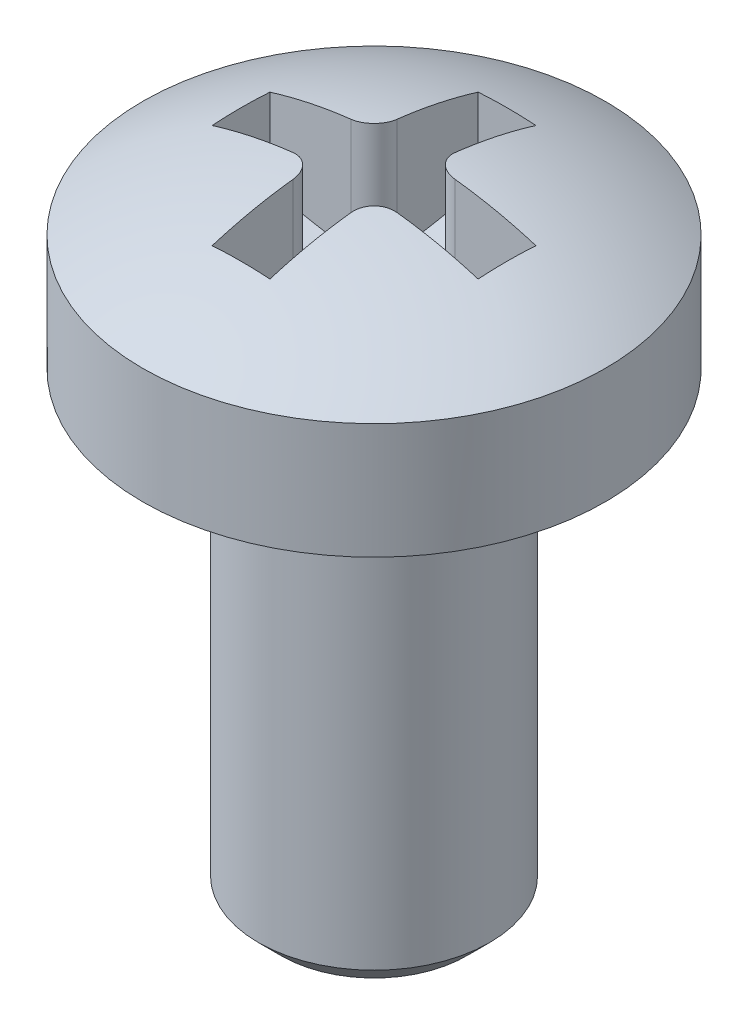
ISO-10303-21;
HEADER;
FILE_DESCRIPTION(('STEP AP214'),'2;1');
FILE_NAME('part.step','',(''),(''),'','','');
FILE_SCHEMA(('AUTOMOTIVE_DESIGN { 1 0 10303 214 1 1 1 1 }'));
ENDSEC;
DATA;
#1=APPLICATION_CONTEXT('core data for automotive mechanical design processes');
#2=APPLICATION_PROTOCOL_DEFINITION('international standard','automotive_design',2000,#1);
#3=PRODUCT_CONTEXT('',#1,'mechanical');
#4=PRODUCT('Part','Part','',(#3));
#5=PRODUCT_RELATED_PRODUCT_CATEGORY('part','',(#4));
#6=PRODUCT_DEFINITION_FORMATION('','',#4);
#7=PRODUCT_DEFINITION_CONTEXT('part definition',#1,'design');
#8=PRODUCT_DEFINITION('design','',#6,#7);
#9=PRODUCT_DEFINITION_SHAPE('','',#8);
#10=(LENGTH_UNIT() NAMED_UNIT(*) SI_UNIT(.MILLI.,.METRE.));
#11=(NAMED_UNIT(*) PLANE_ANGLE_UNIT() SI_UNIT($,.RADIAN.));
#12=(NAMED_UNIT(*) SI_UNIT($,.STERADIAN.) SOLID_ANGLE_UNIT());
#13=UNCERTAINTY_MEASURE_WITH_UNIT(LENGTH_MEASURE(1.E-05),#10,'distance_accuracy_value','');
#14=(GEOMETRIC_REPRESENTATION_CONTEXT(3) GLOBAL_UNCERTAINTY_ASSIGNED_CONTEXT((#13)) GLOBAL_UNIT_ASSIGNED_CONTEXT((#10,
#11,#12)) REPRESENTATION_CONTEXT('',''));
#15=CARTESIAN_POINT('',(0.,0.,0.));
#16=DIRECTION('',(0.,0.,1.));
#17=DIRECTION('',(1.,0.,0.));
#18=AXIS2_PLACEMENT_3D('',#15,#16,#17);
#19=CARTESIAN_POINT('',(2.,-8.,0.));
#20=DIRECTION('',(0.,1.,0.));
#21=DIRECTION('',(0.,0.,1.));
#22=AXIS2_PLACEMENT_3D('',#19,#20,#21);
#23=PLANE('',#22);
#24=CARTESIAN_POINT('',(0.,-8.,0.));
#25=DIRECTION('',(0.,1.,0.));
#26=DIRECTION('',(0.,0.,1.));
#27=AXIS2_PLACEMENT_3D('',#24,#25,#26);
#28=CIRCLE('',#27,1.6);
#29=CARTESIAN_POINT('',(0.,-8.,1.6));
#30=VERTEX_POINT('',#29);
#31=EDGE_CURVE('E11',#30,#30,#28,.F.);
#32=ORIENTED_EDGE('',*,*,#31,.T.);
#33=EDGE_LOOP('',(#32));
#34=FACE_BOUND('',#33,.T.);
#35=ADVANCED_FACE('F37',(#34),#23,.F.);
#36=CARTESIAN_POINT('',(0.,-4.72272727272728,0.));
#37=DIRECTION('',(0.,1.,0.));
#38=DIRECTION('',(1.,0.,0.));
#39=AXIS2_PLACEMENT_3D('',#36,#37,#38);
#40=SPHERICAL_SURFACE('',#39,7.82272727272728);
#41=CARTESIAN_POINT('',(0.5,-4.72272727272728,0.));
#42=DIRECTION('',(1.,0.,0.));
#43=DIRECTION('',(0.,0.,-1.));
#44=AXIS2_PLACEMENT_3D('',#41,#42,#43);
#45=CIRCLE('',#44,7.80673183755348);
#46=CARTESIAN_POINT('',(0.499999999999999,2.73750476008987,-2.3));
#47=VERTEX_POINT('',#46);
#48=CARTESIAN_POINT('',(0.5,3.03195273249996,-0.9));
#49=VERTEX_POINT('',#48);
#50=EDGE_CURVE('E195',#47,#49,#45,.T.);
#51=ORIENTED_EDGE('',*,*,#50,.T.);
#52=CARTESIAN_POINT('',(0.5,3.03195273249996,-0.9));
#53=CARTESIAN_POINT('',(0.499980445653111,3.03454133641409,-0.877715199489853));
#54=CARTESIAN_POINT('',(0.501861325410846,3.0369109081898,-0.855406290685576));
#55=CARTESIAN_POINT('',(0.509308944557218,3.04115309750786,-0.811373363194762));
#56=CARTESIAN_POINT('',(0.514874142284133,3.04302592244948,-0.789649103823202));
#57=CARTESIAN_POINT('',(0.529581237998282,3.04621922226135,-0.747382590966706));
#58=CARTESIAN_POINT('',(0.538725894104163,3.0475392695665,-0.726841263013532));
#59=CARTESIAN_POINT('',(0.560335395409864,3.04958563422558,-0.687561895208892));
#60=CARTESIAN_POINT('',(0.572799188800053,3.05031213937239,-0.668823286645484));
#61=CARTESIAN_POINT('',(0.600596407799792,3.05114682561896,-0.633816736919395));
#62=CARTESIAN_POINT('',(0.615908512897499,3.05125942358876,-0.617531968951503));
#63=CARTESIAN_POINT('',(0.649026593510928,3.0508747494218,-0.587736528915892));
#64=CARTESIAN_POINT('',(0.666832948845617,3.05037738431157,-0.57422628012003));
#65=CARTESIAN_POINT('',(0.704363578386314,3.04879030089852,-0.550401537052683));
#66=CARTESIAN_POINT('',(0.724081674108829,3.04770244181268,-0.540077170971166));
#67=CARTESIAN_POINT('',(0.764919862434989,3.04496752601447,-0.522847557382613));
#68=CARTESIAN_POINT('',(0.786039420133905,3.04332068167708,-0.515941013789887));
#69=CARTESIAN_POINT('',(0.822714805755103,3.04007942212771,-0.5072274099574));
#70=CARTESIAN_POINT('',(0.838074093965797,3.03861284502167,-0.504517057384848));
#71=CARTESIAN_POINT('',(0.868957976534767,3.0354499847468,-0.500903202638105));
#72=CARTESIAN_POINT('',(0.884482302646609,3.03375403356009,-0.499997118337815));
#73=CARTESIAN_POINT('',(0.9,3.03195273249996,-0.5));
#74=B_SPLINE_CURVE_WITH_KNOTS('',3,(#52,#53,#54,#55,#56,#57,#58,#59,#60,#61,#62,#63,#64,#65,#66,
#67,#68,#69,#70,#71,#72,#73),.UNSPECIFIED.,.F.,.F.,(4,2,2,2,2,2,2,2,2,2,4),(0.,
0.0672224170043276,0.134416723302517,0.201662907801201,0.268887807795911,0.335628401088124,
0.402379168562592,0.468920974876219,0.535437528240593,0.582332561709017,0.629160434341086),.UNSPECIFIED.);
#75=CARTESIAN_POINT('',(0.9,3.03195273249996,-0.5));
#76=VERTEX_POINT('',#75);
#77=EDGE_CURVE('E257',#49,#76,#74,.T.);
#78=ORIENTED_EDGE('',*,*,#77,.T.);
#79=CARTESIAN_POINT('',(0.,-4.72272727272728,-0.5));
#80=DIRECTION('',(0.,0.,-1.));
#81=DIRECTION('',(-1.,0.,0.));
#82=AXIS2_PLACEMENT_3D('',#79,#80,#81);
#83=CIRCLE('',#82,7.80673183755348);
#84=CARTESIAN_POINT('',(2.3,2.73750476008987,-0.5));
#85=VERTEX_POINT('',#84);
#86=EDGE_CURVE('E193',#76,#85,#83,.T.);
#87=ORIENTED_EDGE('',*,*,#86,.T.);
#88=CARTESIAN_POINT('',(2.3,-4.72272727272728,0.));
#89=DIRECTION('',(1.,0.,0.));
#90=DIRECTION('',(0.,0.,-1.));
#91=AXIS2_PLACEMENT_3D('',#88,#89,#90);
#92=CIRCLE('',#91,7.47696876972688);
#93=CARTESIAN_POINT('',(2.3,2.73750476008987,0.5));
#94=VERTEX_POINT('',#93);
#95=EDGE_CURVE('E170',#85,#94,#92,.T.);
#96=ORIENTED_EDGE('',*,*,#95,.T.);
#97=CARTESIAN_POINT('',(0.,-4.72272727272728,0.5));
#98=DIRECTION('',(0.,0.,1.));
#99=DIRECTION('',(1.,0.,0.));
#100=AXIS2_PLACEMENT_3D('',#97,#98,#99);
#101=CIRCLE('',#100,7.80673183755348);
#102=CARTESIAN_POINT('',(0.9,3.03195273249996,0.5));
#103=VERTEX_POINT('',#102);
#104=EDGE_CURVE('E219',#94,#103,#101,.T.);
#105=ORIENTED_EDGE('',*,*,#104,.T.);
#106=CARTESIAN_POINT('',(0.9,3.03195273249996,0.5));
#107=CARTESIAN_POINT('',(0.877715199489853,3.03454133641409,0.499980445653111));
#108=CARTESIAN_POINT('',(0.855406290685576,3.0369109081898,0.501861325410847));
#109=CARTESIAN_POINT('',(0.811373363194762,3.04115309750786,0.509308944557218));
#110=CARTESIAN_POINT('',(0.789649103823202,3.04302592244948,0.514874142284133));
#111=CARTESIAN_POINT('',(0.747382590966706,3.04621922226135,0.529581237998282));
#112=CARTESIAN_POINT('',(0.726841263013532,3.0475392695665,0.538725894104163));
#113=CARTESIAN_POINT('',(0.687561895208891,3.04958563422558,0.560335395409864));
#114=CARTESIAN_POINT('',(0.668823286645484,3.05031213937239,0.572799188800053));
#115=CARTESIAN_POINT('',(0.633816736919395,3.05114682561896,0.600596407799792));
#116=CARTESIAN_POINT('',(0.617531968951503,3.05125942358877,0.6159085128975));
#117=CARTESIAN_POINT('',(0.587736528915892,3.0508747494218,0.649026593510929));
#118=CARTESIAN_POINT('',(0.57422628012003,3.05037738431157,0.666832948845617));
#119=CARTESIAN_POINT('',(0.550401537052683,3.04879030089852,0.704363578386314));
#120=CARTESIAN_POINT('',(0.540077170971166,3.04770244181268,0.724081674108829));
#121=CARTESIAN_POINT('',(0.522847557382613,3.04496752601447,0.764919862434989));
#122=CARTESIAN_POINT('',(0.515941013789886,3.04332068167708,0.786039420133905));
#123=CARTESIAN_POINT('',(0.5072274099574,3.04007942212771,0.822714805755103));
#124=CARTESIAN_POINT('',(0.504517057384848,3.03861284502167,0.838074093965798));
#125=CARTESIAN_POINT('',(0.500903202638105,3.03544998474679,0.868957976534767));
#126=CARTESIAN_POINT('',(0.499997118337815,3.03375403356009,0.884482302646609));
#127=CARTESIAN_POINT('',(0.5,3.03195273249996,0.9));
#128=B_SPLINE_CURVE_WITH_KNOTS('',3,(#106,#107,#108,#109,#110,#111,#112,#113,#114,#115,#116,
#117,#118,#119,#120,#121,#122,#123,#124,#125,#126,#127),.UNSPECIFIED.,.F.,.F.,(4,2,2,2,2,2,2,2,
2,2,4),(0.,0.0672224170043276,0.134416723302517,0.201662907801201,0.268887807795911,
0.335628401088124,0.402379168562592,0.468920974876219,0.535437528240593,0.582332561709017,
0.629160434341086),.UNSPECIFIED.);
#129=CARTESIAN_POINT('',(0.5,3.03195273249996,0.9));
#130=VERTEX_POINT('',#129);
#131=EDGE_CURVE('E252',#103,#130,#128,.T.);
#132=ORIENTED_EDGE('',*,*,#131,.T.);
#133=CARTESIAN_POINT('',(0.5,-4.72272727272728,0.));
#134=DIRECTION('',(1.,0.,0.));
#135=DIRECTION('',(0.,0.,-1.));
#136=AXIS2_PLACEMENT_3D('',#133,#134,#135);
#137=CIRCLE('',#136,7.80673183755348);
#138=CARTESIAN_POINT('',(0.5,2.73750476008987,2.3));
#139=VERTEX_POINT('',#138);
#140=EDGE_CURVE('E217',#130,#139,#137,.T.);
#141=ORIENTED_EDGE('',*,*,#140,.T.);
#142=CARTESIAN_POINT('',(0.,-4.72272727272728,2.3));
#143=DIRECTION('',(0.,0.,1.));
#144=DIRECTION('',(1.,0.,0.));
#145=AXIS2_PLACEMENT_3D('',#142,#143,#144);
#146=CIRCLE('',#145,7.47696876972688);
#147=CARTESIAN_POINT('',(-0.5,2.73750476008987,2.3));
#148=VERTEX_POINT('',#147);
#149=EDGE_CURVE('E214',#139,#148,#146,.T.);
#150=ORIENTED_EDGE('',*,*,#149,.T.);
#151=CARTESIAN_POINT('',(-0.5,-4.72272727272728,0.));
#152=DIRECTION('',(-1.,0.,0.));
#153=DIRECTION('',(0.,0.,1.));
#154=AXIS2_PLACEMENT_3D('',#151,#152,#153);
#155=CIRCLE('',#154,7.80673183755348);
#156=CARTESIAN_POINT('',(-0.5,3.03195273249996,0.9));
#157=VERTEX_POINT('',#156);
#158=EDGE_CURVE('E211',#148,#157,#155,.T.);
#159=ORIENTED_EDGE('',*,*,#158,.T.);
#160=CARTESIAN_POINT('',(-0.5,3.03195273249996,0.9));
#161=CARTESIAN_POINT('',(-0.499980445653111,3.03454133641409,0.877715199489853));
#162=CARTESIAN_POINT('',(-0.501861325410847,3.0369109081898,0.855406290685576));
#163=CARTESIAN_POINT('',(-0.509308944557218,3.04115309750786,0.811373363194762));
#164=CARTESIAN_POINT('',(-0.514874142284133,3.04302592244948,0.789649103823202));
#165=CARTESIAN_POINT('',(-0.529581237998282,3.04621922226135,0.747382590966706));
#166=CARTESIAN_POINT('',(-0.538725894104163,3.0475392695665,0.726841263013532));
#167=CARTESIAN_POINT('',(-0.560335395409864,3.04958563422558,0.687561895208891));
#168=CARTESIAN_POINT('',(-0.572799188800053,3.05031213937239,0.668823286645484));
#169=CARTESIAN_POINT('',(-0.600596407799792,3.05114682561896,0.633816736919395));
#170=CARTESIAN_POINT('',(-0.6159085128975,3.05125942358876,0.617531968951503));
#171=CARTESIAN_POINT('',(-0.649026593510929,3.0508747494218,0.587736528915892));
#172=CARTESIAN_POINT('',(-0.666832948845617,3.05037738431157,0.57422628012003));
#173=CARTESIAN_POINT('',(-0.704363578386314,3.04879030089852,0.550401537052683));
#174=CARTESIAN_POINT('',(-0.724081674108829,3.04770244181268,0.540077170971166));
#175=CARTESIAN_POINT('',(-0.764919862434989,3.04496752601447,0.522847557382613));
#176=CARTESIAN_POINT('',(-0.786039420133905,3.04332068167708,0.515941013789886));
#177=CARTESIAN_POINT('',(-0.822714805755104,3.04007942212771,0.5072274099574));
#178=CARTESIAN_POINT('',(-0.838074093965798,3.03861284502167,0.504517057384848));
#179=CARTESIAN_POINT('',(-0.868957976534767,3.0354499847468,0.500903202638105));
#180=CARTESIAN_POINT('',(-0.88448230264661,3.03375403356009,0.499997118337815));
#181=CARTESIAN_POINT('',(-0.9,3.03195273249996,0.5));
#182=B_SPLINE_CURVE_WITH_KNOTS('',3,(#160,#161,#162,#163,#164,#165,#166,#167,#168,#169,#170,
#171,#172,#173,#174,#175,#176,#177,#178,#179,#180,#181),.UNSPECIFIED.,.F.,.F.,(4,2,2,2,2,2,2,2,
2,2,4),(0.,0.0672224170043276,0.134416723302517,0.201662907801201,0.268887807795911,
0.335628401088124,0.402379168562592,0.468920974876219,0.535437528240593,0.582332561709017,
0.629160434341086),.UNSPECIFIED.);
#183=CARTESIAN_POINT('',(-0.9,3.03195273249996,0.5));
#184=VERTEX_POINT('',#183);
#185=EDGE_CURVE('E231',#157,#184,#182,.T.);
#186=ORIENTED_EDGE('',*,*,#185,.T.);
#187=CARTESIAN_POINT('',(0.,-4.72272727272728,0.5));
#188=DIRECTION('',(0.,0.,1.));
#189=DIRECTION('',(1.,0.,0.));
#190=AXIS2_PLACEMENT_3D('',#187,#188,#189);
#191=CIRCLE('',#190,7.80673183755348);
#192=CARTESIAN_POINT('',(-2.3,2.73750476008987,0.5));
#193=VERTEX_POINT('',#192);
#194=EDGE_CURVE('E209',#184,#193,#191,.T.);
#195=ORIENTED_EDGE('',*,*,#194,.T.);
#196=CARTESIAN_POINT('',(-2.3,-4.72272727272728,0.));
#197=DIRECTION('',(-1.,0.,0.));
#198=DIRECTION('',(0.,0.,1.));
#199=AXIS2_PLACEMENT_3D('',#196,#197,#198);
#200=CIRCLE('',#199,7.47696876972688);
#201=CARTESIAN_POINT('',(-2.3,2.73750476008987,-0.5));
#202=VERTEX_POINT('',#201);
#203=EDGE_CURVE('E206',#193,#202,#200,.T.);
#204=ORIENTED_EDGE('',*,*,#203,.T.);
#205=CARTESIAN_POINT('',(0.,-4.72272727272728,-0.5));
#206=DIRECTION('',(0.,0.,-1.));
#207=DIRECTION('',(-1.,0.,0.));
#208=AXIS2_PLACEMENT_3D('',#205,#206,#207);
#209=CIRCLE('',#208,7.80673183755348);
#210=CARTESIAN_POINT('',(-0.9,3.03195273249996,-0.5));
#211=VERTEX_POINT('',#210);
#212=EDGE_CURVE('E203',#202,#211,#209,.T.);
#213=ORIENTED_EDGE('',*,*,#212,.T.);
#214=CARTESIAN_POINT('',(-0.9,3.03195273249996,-0.5));
#215=CARTESIAN_POINT('',(-0.877715199489853,3.03454133641409,-0.499980445653111));
#216=CARTESIAN_POINT('',(-0.855406290685576,3.0369109081898,-0.501861325410847));
#217=CARTESIAN_POINT('',(-0.811373363194762,3.04115309750786,-0.509308944557218));
#218=CARTESIAN_POINT('',(-0.789649103823202,3.04302592244948,-0.514874142284133));
#219=CARTESIAN_POINT('',(-0.747382590966706,3.04621922226135,-0.529581237998282));
#220=CARTESIAN_POINT('',(-0.726841263013532,3.0475392695665,-0.538725894104163));
#221=CARTESIAN_POINT('',(-0.687561895208891,3.04958563422558,-0.560335395409864));
#222=CARTESIAN_POINT('',(-0.668823286645484,3.05031213937239,-0.572799188800053));
#223=CARTESIAN_POINT('',(-0.633816736919395,3.05114682561896,-0.600596407799792));
#224=CARTESIAN_POINT('',(-0.617531968951503,3.05125942358877,-0.6159085128975));
#225=CARTESIAN_POINT('',(-0.587736528915892,3.0508747494218,-0.649026593510929));
#226=CARTESIAN_POINT('',(-0.57422628012003,3.05037738431157,-0.666832948845617));
#227=CARTESIAN_POINT('',(-0.550401537052683,3.04879030089852,-0.704363578386314));
#228=CARTESIAN_POINT('',(-0.540077170971166,3.04770244181268,-0.724081674108829));
#229=CARTESIAN_POINT('',(-0.522847557382613,3.04496752601447,-0.764919862434989));
#230=CARTESIAN_POINT('',(-0.515941013789886,3.04332068167708,-0.786039420133905));
#231=CARTESIAN_POINT('',(-0.5072274099574,3.04007942212771,-0.822714805755103));
#232=CARTESIAN_POINT('',(-0.504517057384848,3.03861284502167,-0.838074093965798));
#233=CARTESIAN_POINT('',(-0.500903202638105,3.03544998474679,-0.868957976534767));
#234=CARTESIAN_POINT('',(-0.499997118337815,3.03375403356009,-0.88448230264661));
#235=CARTESIAN_POINT('',(-0.5,3.03195273249996,-0.9));
#236=B_SPLINE_CURVE_WITH_KNOTS('',3,(#214,#215,#216,#217,#218,#219,#220,#221,#222,#223,#224,
#225,#226,#227,#228,#229,#230,#231,#232,#233,#234,#235),.UNSPECIFIED.,.F.,.F.,(4,2,2,2,2,2,2,2,
2,2,4),(0.,0.0672224170043276,0.134416723302517,0.201662907801201,0.268887807795911,
0.335628401088124,0.402379168562592,0.468920974876219,0.535437528240593,0.582332561709017,
0.629160434341086),.UNSPECIFIED.);
#237=CARTESIAN_POINT('',(-0.5,3.03195273249996,-0.9));
#238=VERTEX_POINT('',#237);
#239=EDGE_CURVE('E225',#211,#238,#236,.T.);
#240=ORIENTED_EDGE('',*,*,#239,.T.);
#241=CARTESIAN_POINT('',(-0.5,-4.72272727272728,0.));
#242=DIRECTION('',(-1.,0.,0.));
#243=DIRECTION('',(0.,0.,1.));
#244=AXIS2_PLACEMENT_3D('',#241,#242,#243);
#245=CIRCLE('',#244,7.80673183755348);
#246=CARTESIAN_POINT('',(-0.5,2.73750476008987,-2.3));
#247=VERTEX_POINT('',#246);
#248=EDGE_CURVE('E201',#238,#247,#245,.T.);
#249=ORIENTED_EDGE('',*,*,#248,.T.);
#250=CARTESIAN_POINT('',(0.,-4.72272727272728,-2.3));
#251=DIRECTION('',(0.,0.,-1.));
#252=DIRECTION('',(-1.,0.,0.));
#253=AXIS2_PLACEMENT_3D('',#250,#251,#252);
#254=CIRCLE('',#253,7.47696876972688);
#255=EDGE_CURVE('E198',#247,#47,#254,.T.);
#256=ORIENTED_EDGE('',*,*,#255,.T.);
#257=EDGE_LOOP('',(#51,#78,#87,#96,#105,#132,#141,#150,#159,#186,#195,#204,#213,#240,#249,#256));
#258=FACE_BOUND('',#257,.T.);
#259=CARTESIAN_POINT('',(0.,2.,0.));
#260=DIRECTION('',(0.,1.,0.));
#261=DIRECTION('',(0.,0.,1.));
#262=AXIS2_PLACEMENT_3D('',#259,#260,#261);
#263=CIRCLE('',#262,4.);
#264=CARTESIAN_POINT('',(0.,2.,4.));
#265=VERTEX_POINT('',#264);
#266=EDGE_CURVE('E189',#265,#265,#263,.T.);
#267=ORIENTED_EDGE('',*,*,#266,.T.);
#268=EDGE_LOOP('',(#267));
#269=FACE_BOUND('',#268,.T.);
#270=ADVANCED_FACE('F239',(#258,#269),#40,.T.);
#271=CARTESIAN_POINT('',(0.,3.1,0.));
#272=DIRECTION('',(0.,1.,0.));
#273=DIRECTION('',(0.,0.,1.));
#274=AXIS2_PLACEMENT_3D('',#271,#272,#273);
#275=CYLINDRICAL_SURFACE('',#274,4.);
#276=ORIENTED_EDGE('',*,*,#266,.F.);
#277=EDGE_LOOP('',(#276));
#278=FACE_BOUND('',#277,.T.);
#279=CARTESIAN_POINT('',(0.,0.,0.));
#280=DIRECTION('',(0.,1.,0.));
#281=DIRECTION('',(0.,0.,1.));
#282=AXIS2_PLACEMENT_3D('',#279,#280,#281);
#283=CIRCLE('',#282,4.);
#284=CARTESIAN_POINT('',(0.,0.,4.));
#285=VERTEX_POINT('',#284);
#286=EDGE_CURVE('E181',#285,#285,#283,.T.);
#287=ORIENTED_EDGE('',*,*,#286,.T.);
#288=EDGE_LOOP('',(#287));
#289=FACE_BOUND('',#288,.T.);
#290=ADVANCED_FACE('F244',(#278,#289),#275,.T.);
#291=CARTESIAN_POINT('',(4.,0.,0.));
#292=DIRECTION('',(0.,1.,0.));
#293=DIRECTION('',(0.,0.,1.));
#294=AXIS2_PLACEMENT_3D('',#291,#292,#293);
#295=PLANE('',#294);
#296=ORIENTED_EDGE('',*,*,#286,.F.);
#297=EDGE_LOOP('',(#296));
#298=FACE_BOUND('',#297,.T.);
#299=CARTESIAN_POINT('',(0.,0.,0.));
#300=DIRECTION('',(0.,1.,0.));
#301=DIRECTION('',(0.,0.,1.));
#302=AXIS2_PLACEMENT_3D('',#299,#300,#301);
#303=CIRCLE('',#302,2.);
#304=CARTESIAN_POINT('',(0.,0.,2.));
#305=VERTEX_POINT('',#304);
#306=EDGE_CURVE('E178',#305,#305,#303,.T.);
#307=ORIENTED_EDGE('',*,*,#306,.T.);
#308=EDGE_LOOP('',(#307));
#309=FACE_BOUND('',#308,.T.);
#310=ADVANCED_FACE('F331',(#298,#309),#295,.F.);
#311=CARTESIAN_POINT('',(0.,3.1,0.));
#312=DIRECTION('',(0.,1.,0.));
#313=DIRECTION('',(0.,0.,1.));
#314=AXIS2_PLACEMENT_3D('',#311,#312,#313);
#315=CYLINDRICAL_SURFACE('',#314,2.);
#316=CARTESIAN_POINT('',(0.,-7.6,0.));
#317=DIRECTION('',(0.,1.,0.));
#318=DIRECTION('',(0.,0.,1.));
#319=AXIS2_PLACEMENT_3D('',#316,#317,#318);
#320=CIRCLE('',#319,2.);
#321=CARTESIAN_POINT('',(0.,-7.6,2.));
#322=VERTEX_POINT('',#321);
#323=EDGE_CURVE('E45',#322,#322,#320,.T.);
#324=ORIENTED_EDGE('',*,*,#323,.T.);
#325=EDGE_LOOP('',(#324));
#326=FACE_BOUND('',#325,.T.);
#327=ORIENTED_EDGE('',*,*,#306,.F.);
#328=EDGE_LOOP('',(#327));
#329=FACE_BOUND('',#328,.T.);
#330=ADVANCED_FACE('F303',(#326,#329),#315,.T.);
#331=CARTESIAN_POINT('',(0.5,-8.001,0.5));
#332=DIRECTION('',(0.,0.,1.));
#333=DIRECTION('',(1.,0.,0.));
#334=AXIS2_PLACEMENT_3D('',#331,#332,#333);
#335=PLANE('',#334);
#336=CARTESIAN_POINT('',(0.,9.49999999999998,0.5));
#337=DIRECTION('',(0.,0.,1.));
#338=DIRECTION('',(1.,0.,0.));
#339=AXIS2_PLACEMENT_3D('',#336,#337,#338);
#340=CIRCLE('',#339,8.48528137423855);
#341=CARTESIAN_POINT('',(2.3,1.3323810079069,0.5));
#342=VERTEX_POINT('',#341);
#343=CARTESIAN_POINT('',(0.9,1.06258333374486,0.5));
#344=VERTEX_POINT('',#343);
#345=EDGE_CURVE('E176',#342,#344,#340,.F.);
#346=ORIENTED_EDGE('',*,*,#345,.T.);
#347=DIRECTION('',(0.,1.,0.));
#348=VECTOR('',#347,1.);
#349=CARTESIAN_POINT('',(0.9,-8.001,0.5));
#350=LINE('',#349,#348);
#351=EDGE_CURVE('E556',#344,#103,#350,.T.);
#352=ORIENTED_EDGE('',*,*,#351,.T.);
#353=ORIENTED_EDGE('',*,*,#104,.F.);
#354=DIRECTION('',(0.,1.,0.));
#355=VECTOR('',#354,1.);
#356=CARTESIAN_POINT('',(2.3,-8.001,0.5));
#357=LINE('',#356,#355);
#358=EDGE_CURVE('E172',#342,#94,#357,.T.);
#359=ORIENTED_EDGE('',*,*,#358,.F.);
#360=EDGE_LOOP('',(#346,#352,#353,#359));
#361=FACE_BOUND('',#360,.T.);
#362=ADVANCED_FACE('F344',(#361),#335,.F.);
#363=CARTESIAN_POINT('',(0.5,-8.001,0.5));
#364=DIRECTION('',(1.,0.,0.));
#365=DIRECTION('',(0.,0.,-1.));
#366=AXIS2_PLACEMENT_3D('',#363,#364,#365);
#367=PLANE('',#366);
#368=ORIENTED_EDGE('',*,*,#140,.F.);
#369=DIRECTION('',(0.,1.,0.));
#370=VECTOR('',#369,1.);
#371=CARTESIAN_POINT('',(0.5,-8.001,0.9));
#372=LINE('',#371,#370);
#373=CARTESIAN_POINT('',(0.5,1.06258333374486,0.9));
#374=VERTEX_POINT('',#373);
#375=EDGE_CURVE('E554',#130,#374,#372,.F.);
#376=ORIENTED_EDGE('',*,*,#375,.T.);
#377=CARTESIAN_POINT('',(0.5,9.49999999999998,0.));
#378=DIRECTION('',(1.,0.,0.));
#379=DIRECTION('',(0.,0.,-1.));
#380=AXIS2_PLACEMENT_3D('',#377,#378,#379);
#381=CIRCLE('',#380,8.48528137423855);
#382=CARTESIAN_POINT('',(0.5,1.3323810079069,2.3));
#383=VERTEX_POINT('',#382);
#384=EDGE_CURVE('E183',#374,#383,#381,.F.);
#385=ORIENTED_EDGE('',*,*,#384,.T.);
#386=DIRECTION('',(0.,1.,0.));
#387=VECTOR('',#386,1.);
#388=CARTESIAN_POINT('',(0.5,-8.001,2.3));
#389=LINE('',#388,#387);
#390=EDGE_CURVE('E162',#383,#139,#389,.T.);
#391=ORIENTED_EDGE('',*,*,#390,.T.);
#392=EDGE_LOOP('',(#368,#376,#385,#391));
#393=FACE_BOUND('',#392,.T.);
#394=ADVANCED_FACE('F292',(#393),#367,.F.);
#395=CARTESIAN_POINT('',(-0.5,-8.001,2.3));
#396=DIRECTION('',(0.,0.,1.));
#397=DIRECTION('',(1.,0.,0.));
#398=AXIS2_PLACEMENT_3D('',#395,#396,#397);
#399=PLANE('',#398);
#400=ORIENTED_EDGE('',*,*,#390,.F.);
#401=CARTESIAN_POINT('',(0.,9.49999999999998,2.3));
#402=DIRECTION('',(0.,0.,1.));
#403=DIRECTION('',(1.,0.,0.));
#404=AXIS2_PLACEMENT_3D('',#401,#402,#403);
#405=CIRCLE('',#404,8.18290901819149);
#406=CARTESIAN_POINT('',(-0.5,1.3323810079069,2.3));
#407=VERTEX_POINT('',#406);
#408=EDGE_CURVE('E518',#383,#407,#405,.F.);
#409=ORIENTED_EDGE('',*,*,#408,.T.);
#410=DIRECTION('',(0.,1.,0.));
#411=VECTOR('',#410,1.);
#412=CARTESIAN_POINT('',(-0.5,-8.001,2.3));
#413=LINE('',#412,#411);
#414=EDGE_CURVE('E517',#407,#148,#413,.T.);
#415=ORIENTED_EDGE('',*,*,#414,.T.);
#416=ORIENTED_EDGE('',*,*,#149,.F.);
#417=EDGE_LOOP('',(#400,#409,#415,#416));
#418=FACE_BOUND('',#417,.T.);
#419=ADVANCED_FACE('F357',(#418),#399,.F.);
#420=CARTESIAN_POINT('',(-0.5,-8.001,0.5));
#421=DIRECTION('',(-1.,0.,0.));
#422=DIRECTION('',(0.,0.,1.));
#423=AXIS2_PLACEMENT_3D('',#420,#421,#422);
#424=PLANE('',#423);
#425=CARTESIAN_POINT('',(-0.5,9.49999999999998,0.));
#426=DIRECTION('',(-1.,0.,0.));
#427=DIRECTION('',(0.,0.,1.));
#428=AXIS2_PLACEMENT_3D('',#425,#426,#427);
#429=CIRCLE('',#428,8.48528137423855);
#430=CARTESIAN_POINT('',(-0.5,1.06258333374486,0.9));
#431=VERTEX_POINT('',#430);
#432=EDGE_CURVE('E512',#407,#431,#429,.F.);
#433=ORIENTED_EDGE('',*,*,#432,.T.);
#434=DIRECTION('',(0.,1.,0.));
#435=VECTOR('',#434,1.);
#436=CARTESIAN_POINT('',(-0.5,-8.001,0.9));
#437=LINE('',#436,#435);
#438=EDGE_CURVE('E507',#431,#157,#437,.T.);
#439=ORIENTED_EDGE('',*,*,#438,.T.);
#440=ORIENTED_EDGE('',*,*,#158,.F.);
#441=ORIENTED_EDGE('',*,*,#414,.F.);
#442=EDGE_LOOP('',(#433,#439,#440,#441));
#443=FACE_BOUND('',#442,.T.);
#444=ADVANCED_FACE('F364',(#443),#424,.F.);
#445=CARTESIAN_POINT('',(-2.3,-8.001,0.5));
#446=DIRECTION('',(0.,0.,1.));
#447=DIRECTION('',(1.,0.,0.));
#448=AXIS2_PLACEMENT_3D('',#445,#446,#447);
#449=PLANE('',#448);
#450=ORIENTED_EDGE('',*,*,#194,.F.);
#451=DIRECTION('',(0.,1.,0.));
#452=VECTOR('',#451,1.);
#453=CARTESIAN_POINT('',(-0.9,-8.001,0.5));
#454=LINE('',#453,#452);
#455=CARTESIAN_POINT('',(-0.9,1.06258333374486,0.5));
#456=VERTEX_POINT('',#455);
#457=EDGE_CURVE('E505',#184,#456,#454,.F.);
#458=ORIENTED_EDGE('',*,*,#457,.T.);
#459=CARTESIAN_POINT('',(0.,9.49999999999998,0.5));
#460=DIRECTION('',(0.,0.,1.));
#461=DIRECTION('',(1.,0.,0.));
#462=AXIS2_PLACEMENT_3D('',#459,#460,#461);
#463=CIRCLE('',#462,8.48528137423855);
#464=CARTESIAN_POINT('',(-2.3,1.3323810079069,0.5));
#465=VERTEX_POINT('',#464);
#466=EDGE_CURVE('E515',#456,#465,#463,.F.);
#467=ORIENTED_EDGE('',*,*,#466,.T.);
#468=DIRECTION('',(0.,1.,0.));
#469=VECTOR('',#468,1.);
#470=CARTESIAN_POINT('',(-2.3,-8.001,0.5));
#471=LINE('',#470,#469);
#472=EDGE_CURVE('E529',#465,#193,#471,.T.);
#473=ORIENTED_EDGE('',*,*,#472,.T.);
#474=EDGE_LOOP('',(#450,#458,#467,#473));
#475=FACE_BOUND('',#474,.T.);
#476=ADVANCED_FACE('F371',(#475),#449,.F.);
#477=CARTESIAN_POINT('',(-2.3,-8.001,-0.5));
#478=DIRECTION('',(-1.,0.,0.));
#479=DIRECTION('',(0.,0.,1.));
#480=AXIS2_PLACEMENT_3D('',#477,#478,#479);
#481=PLANE('',#480);
#482=ORIENTED_EDGE('',*,*,#472,.F.);
#483=CARTESIAN_POINT('',(-2.3,9.49999999999998,0.));
#484=DIRECTION('',(-1.,0.,0.));
#485=DIRECTION('',(0.,0.,1.));
#486=AXIS2_PLACEMENT_3D('',#483,#484,#485);
#487=CIRCLE('',#486,8.18290901819149);
#488=CARTESIAN_POINT('',(-2.3,1.3323810079069,-0.5));
#489=VERTEX_POINT('',#488);
#490=EDGE_CURVE('E521',#465,#489,#487,.F.);
#491=ORIENTED_EDGE('',*,*,#490,.T.);
#492=DIRECTION('',(0.,1.,0.));
#493=VECTOR('',#492,1.);
#494=CARTESIAN_POINT('',(-2.3,-8.001,-0.5));
#495=LINE('',#494,#493);
#496=EDGE_CURVE('E532',#489,#202,#495,.T.);
#497=ORIENTED_EDGE('',*,*,#496,.T.);
#498=ORIENTED_EDGE('',*,*,#203,.F.);
#499=EDGE_LOOP('',(#482,#491,#497,#498));
#500=FACE_BOUND('',#499,.T.);
#501=ADVANCED_FACE('F379',(#500),#481,.F.);
#502=CARTESIAN_POINT('',(-2.3,-8.001,-0.5));
#503=DIRECTION('',(0.,0.,-1.));
#504=DIRECTION('',(-1.,0.,0.));
#505=AXIS2_PLACEMENT_3D('',#502,#503,#504);
#506=PLANE('',#505);
#507=CARTESIAN_POINT('',(0.,9.49999999999998,-0.5));
#508=DIRECTION('',(0.,0.,-1.));
#509=DIRECTION('',(-1.,0.,0.));
#510=AXIS2_PLACEMENT_3D('',#507,#508,#509);
#511=CIRCLE('',#510,8.48528137423855);
#512=CARTESIAN_POINT('',(-0.9,1.06258333374486,-0.5));
#513=VERTEX_POINT('',#512);
#514=EDGE_CURVE('E564',#489,#513,#511,.F.);
#515=ORIENTED_EDGE('',*,*,#514,.T.);
#516=DIRECTION('',(0.,1.,0.));
#517=VECTOR('',#516,1.);
#518=CARTESIAN_POINT('',(-0.9,-8.001,-0.5));
#519=LINE('',#518,#517);
#520=EDGE_CURVE('E549',#513,#211,#519,.T.);
#521=ORIENTED_EDGE('',*,*,#520,.T.);
#522=ORIENTED_EDGE('',*,*,#212,.F.);
#523=ORIENTED_EDGE('',*,*,#496,.F.);
#524=EDGE_LOOP('',(#515,#521,#522,#523));
#525=FACE_BOUND('',#524,.T.);
#526=ADVANCED_FACE('F387',(#525),#506,.F.);
#527=CARTESIAN_POINT('',(-0.5,-8.001,-2.3));
#528=DIRECTION('',(-1.,0.,0.));
#529=DIRECTION('',(0.,0.,1.));
#530=AXIS2_PLACEMENT_3D('',#527,#528,#529);
#531=PLANE('',#530);
#532=ORIENTED_EDGE('',*,*,#248,.F.);
#533=DIRECTION('',(0.,1.,0.));
#534=VECTOR('',#533,1.);
#535=CARTESIAN_POINT('',(-0.5,-8.001,-0.9));
#536=LINE('',#535,#534);
#537=CARTESIAN_POINT('',(-0.5,1.06258333374486,-0.9));
#538=VERTEX_POINT('',#537);
#539=EDGE_CURVE('E52',#238,#538,#536,.F.);
#540=ORIENTED_EDGE('',*,*,#539,.T.);
#541=CARTESIAN_POINT('',(-0.5,9.49999999999998,0.));
#542=DIRECTION('',(-1.,0.,0.));
#543=DIRECTION('',(0.,0.,1.));
#544=AXIS2_PLACEMENT_3D('',#541,#542,#543);
#545=CIRCLE('',#544,8.48528137423855);
#546=CARTESIAN_POINT('',(-0.5,1.3323810079069,-2.3));
#547=VERTEX_POINT('',#546);
#548=EDGE_CURVE('E560',#538,#547,#545,.F.);
#549=ORIENTED_EDGE('',*,*,#548,.T.);
#550=DIRECTION('',(0.,1.,0.));
#551=VECTOR('',#550,1.);
#552=CARTESIAN_POINT('',(-0.5,-8.001,-2.3));
#553=LINE('',#552,#551);
#554=EDGE_CURVE('E535',#547,#247,#553,.T.);
#555=ORIENTED_EDGE('',*,*,#554,.T.);
#556=EDGE_LOOP('',(#532,#540,#549,#555));
#557=FACE_BOUND('',#556,.T.);
#558=ADVANCED_FACE('F395',(#557),#531,.F.);
#559=CARTESIAN_POINT('',(-0.5,-8.001,-2.3));
#560=DIRECTION('',(0.,0.,-1.));
#561=DIRECTION('',(-1.,0.,0.));
#562=AXIS2_PLACEMENT_3D('',#559,#560,#561);
#563=PLANE('',#562);
#564=ORIENTED_EDGE('',*,*,#554,.F.);
#565=CARTESIAN_POINT('',(0.,9.49999999999998,-2.3));
#566=DIRECTION('',(0.,0.,-1.));
#567=DIRECTION('',(-1.,0.,0.));
#568=AXIS2_PLACEMENT_3D('',#565,#566,#567);
#569=CIRCLE('',#568,8.18290901819149);
#570=CARTESIAN_POINT('',(0.499999999999999,1.3323810079069,-2.3));
#571=VERTEX_POINT('',#570);
#572=EDGE_CURVE('E543',#547,#571,#569,.F.);
#573=ORIENTED_EDGE('',*,*,#572,.T.);
#574=DIRECTION('',(0.,1.,0.));
#575=VECTOR('',#574,1.);
#576=CARTESIAN_POINT('',(0.5,-8.001,-2.3));
#577=LINE('',#576,#575);
#578=EDGE_CURVE('E171',#571,#47,#577,.T.);
#579=ORIENTED_EDGE('',*,*,#578,.T.);
#580=ORIENTED_EDGE('',*,*,#255,.F.);
#581=EDGE_LOOP('',(#564,#573,#579,#580));
#582=FACE_BOUND('',#581,.T.);
#583=ADVANCED_FACE('F403',(#582),#563,.F.);
#584=CARTESIAN_POINT('',(0.5,-8.001,-2.3));
#585=DIRECTION('',(1.,0.,0.));
#586=DIRECTION('',(0.,0.,-1.));
#587=AXIS2_PLACEMENT_3D('',#584,#585,#586);
#588=PLANE('',#587);
#589=CARTESIAN_POINT('',(0.5,9.49999999999998,0.));
#590=DIRECTION('',(1.,0.,0.));
#591=DIRECTION('',(0.,0.,-1.));
#592=AXIS2_PLACEMENT_3D('',#589,#590,#591);
#593=CIRCLE('',#592,8.48528137423855);
#594=CARTESIAN_POINT('',(0.5,1.06258333374486,-0.9));
#595=VERTEX_POINT('',#594);
#596=EDGE_CURVE('E161',#571,#595,#593,.F.);
#597=ORIENTED_EDGE('',*,*,#596,.T.);
#598=DIRECTION('',(0.,1.,0.));
#599=VECTOR('',#598,1.);
#600=CARTESIAN_POINT('',(0.5,-8.001,-0.9));
#601=LINE('',#600,#599);
#602=EDGE_CURVE('E222',#595,#49,#601,.T.);
#603=ORIENTED_EDGE('',*,*,#602,.T.);
#604=ORIENTED_EDGE('',*,*,#50,.F.);
#605=ORIENTED_EDGE('',*,*,#578,.F.);
#606=EDGE_LOOP('',(#597,#603,#604,#605));
#607=FACE_BOUND('',#606,.T.);
#608=ADVANCED_FACE('F410',(#607),#588,.F.);
#609=CARTESIAN_POINT('',(0.5,-8.001,-0.5));
#610=DIRECTION('',(0.,0.,-1.));
#611=DIRECTION('',(-1.,0.,0.));
#612=AXIS2_PLACEMENT_3D('',#609,#610,#611);
#613=PLANE('',#612);
#614=ORIENTED_EDGE('',*,*,#86,.F.);
#615=DIRECTION('',(0.,1.,0.));
#616=VECTOR('',#615,1.);
#617=CARTESIAN_POINT('',(0.9,-8.001,-0.5));
#618=LINE('',#617,#616);
#619=CARTESIAN_POINT('',(0.9,1.06258333374486,-0.5));
#620=VERTEX_POINT('',#619);
#621=EDGE_CURVE('E158',#76,#620,#618,.F.);
#622=ORIENTED_EDGE('',*,*,#621,.T.);
#623=CARTESIAN_POINT('',(0.,9.49999999999998,-0.5));
#624=DIRECTION('',(0.,0.,-1.));
#625=DIRECTION('',(-1.,0.,0.));
#626=AXIS2_PLACEMENT_3D('',#623,#624,#625);
#627=CIRCLE('',#626,8.48528137423855);
#628=CARTESIAN_POINT('',(2.3,1.3323810079069,-0.5));
#629=VERTEX_POINT('',#628);
#630=EDGE_CURVE('E152',#620,#629,#627,.F.);
#631=ORIENTED_EDGE('',*,*,#630,.T.);
#632=DIRECTION('',(0.,1.,0.));
#633=VECTOR('',#632,1.);
#634=CARTESIAN_POINT('',(2.3,-8.001,-0.5));
#635=LINE('',#634,#633);
#636=EDGE_CURVE('E156',#629,#85,#635,.T.);
#637=ORIENTED_EDGE('',*,*,#636,.T.);
#638=EDGE_LOOP('',(#614,#622,#631,#637));
#639=FACE_BOUND('',#638,.T.);
#640=ADVANCED_FACE('F155',(#639),#613,.F.);
#641=CARTESIAN_POINT('',(2.3,-8.001,-0.5));
#642=DIRECTION('',(1.,0.,0.));
#643=DIRECTION('',(0.,0.,-1.));
#644=AXIS2_PLACEMENT_3D('',#641,#642,#643);
#645=PLANE('',#644);
#646=ORIENTED_EDGE('',*,*,#636,.F.);
#647=CARTESIAN_POINT('',(2.3,9.49999999999998,0.));
#648=DIRECTION('',(1.,0.,0.));
#649=DIRECTION('',(0.,0.,-1.));
#650=AXIS2_PLACEMENT_3D('',#647,#648,#649);
#651=CIRCLE('',#650,8.18290901819149);
#652=EDGE_CURVE('E167',#629,#342,#651,.F.);
#653=ORIENTED_EDGE('',*,*,#652,.T.);
#654=ORIENTED_EDGE('',*,*,#358,.T.);
#655=ORIENTED_EDGE('',*,*,#95,.F.);
#656=EDGE_LOOP('',(#646,#653,#654,#655));
#657=FACE_BOUND('',#656,.T.);
#658=ADVANCED_FACE('F166',(#657),#645,.F.);
#659=CARTESIAN_POINT('',(0.,9.49999999999998,0.));
#660=DIRECTION('',(0.,1.,0.));
#661=DIRECTION('',(1.,0.,0.));
#662=AXIS2_PLACEMENT_3D('',#659,#660,#661);
#663=SPHERICAL_SURFACE('',#662,8.49999999999998);
#664=ORIENTED_EDGE('',*,*,#345,.F.);
#665=ORIENTED_EDGE('',*,*,#652,.F.);
#666=ORIENTED_EDGE('',*,*,#630,.F.);
#667=CARTESIAN_POINT('',(0.9,1.06258333374486,-0.5));
#668=CARTESIAN_POINT('',(0.877681895176581,1.06020064583187,-0.499980506377996));
#669=CARTESIAN_POINT('',(0.855344205727362,1.0580201488652,-0.501866869905914));
#670=CARTESIAN_POINT('',(0.811264196369215,1.05411756501269,-0.509332340473144));
#671=CARTESIAN_POINT('',(0.78952159882242,1.05239526097159,-0.514909693823375));
#672=CARTESIAN_POINT('',(0.747228556255667,1.04945966047884,-0.529643735623788));
#673=CARTESIAN_POINT('',(0.726678990033897,1.04824673524169,-0.538803025087882));
#674=CARTESIAN_POINT('',(0.687389852539137,1.04636746374655,-0.56044228034962));
#675=CARTESIAN_POINT('',(0.668649749482246,1.04570095646757,-0.572921266446781));
#676=CARTESIAN_POINT('',(0.633625729643449,1.04493649451643,-0.600763861630354));
#677=CARTESIAN_POINT('',(0.617327507926939,1.04483509156346,-0.616109383561911));
#678=CARTESIAN_POINT('',(0.587514637710959,1.04519463942213,-0.649299998886556));
#679=CARTESIAN_POINT('',(0.574000432084661,1.04565567962496,-0.667145489209941));
#680=CARTESIAN_POINT('',(0.55017165377276,1.04712438551599,-0.704769667803527));
#681=CARTESIAN_POINT('',(0.539848822620757,1.04813062146146,-0.724543189195622));
#682=CARTESIAN_POINT('',(0.522637980126425,1.05065941614313,-0.765498290560969));
#683=CARTESIAN_POINT('',(0.515748559609182,1.05218176262027,-0.78667928881133));
#684=CARTESIAN_POINT('',(0.507116958212197,1.05516459963325,-0.823303350164225));
#685=CARTESIAN_POINT('',(0.504448298653858,1.05650461680506,-0.838544928463922));
#686=CARTESIAN_POINT('',(0.500889732891837,1.05939256924764,-0.869192646434852));
#687=CARTESIAN_POINT('',(0.499997287547255,1.06094020433808,-0.884598519500552));
#688=CARTESIAN_POINT('',(0.5,1.06258333374486,-0.9));
#689=B_SPLINE_CURVE_WITH_KNOTS('',3,(#667,#668,#669,#670,#671,#672,#673,#674,#675,#676,#677,
#678,#679,#680,#681,#682,#683,#684,#685,#686,#687,#688),.UNSPECIFIED.,.F.,.F.,(4,2,2,2,2,2,2,2,
2,2,4),(0.,0.0672520458092346,0.134472161271656,0.201741179358209,0.268990367163335,
0.33582874565086,0.402677748396607,0.469352286257207,0.535999436300152,0.582495090258099,
0.628924229684279),.UNSPECIFIED.);
#690=EDGE_CURVE('E280',#620,#595,#689,.T.);
#691=ORIENTED_EDGE('',*,*,#690,.T.);
#692=ORIENTED_EDGE('',*,*,#596,.F.);
#693=ORIENTED_EDGE('',*,*,#572,.F.);
#694=ORIENTED_EDGE('',*,*,#548,.F.);
#695=CARTESIAN_POINT('',(-0.5,1.06258333374486,-0.9));
#696=CARTESIAN_POINT('',(-0.499980506377996,1.06020064583187,-0.877681895176581));
#697=CARTESIAN_POINT('',(-0.501866869905914,1.0580201488652,-0.855344205727362));
#698=CARTESIAN_POINT('',(-0.509332340473144,1.05411756501269,-0.811264196369215));
#699=CARTESIAN_POINT('',(-0.514909693823375,1.05239526097159,-0.789521598822421));
#700=CARTESIAN_POINT('',(-0.529643735623788,1.04945966047884,-0.747228556255667));
#701=CARTESIAN_POINT('',(-0.538803025087882,1.04824673524169,-0.726678990033897));
#702=CARTESIAN_POINT('',(-0.560442280349619,1.04636746374655,-0.687389852539137));
#703=CARTESIAN_POINT('',(-0.572921266446781,1.04570095646757,-0.668649749482246));
#704=CARTESIAN_POINT('',(-0.600763861630353,1.04493649451643,-0.633625729643449));
#705=CARTESIAN_POINT('',(-0.616109383561911,1.04483509156346,-0.617327507926939));
#706=CARTESIAN_POINT('',(-0.649299998886555,1.04519463942213,-0.58751463771096));
#707=CARTESIAN_POINT('',(-0.667145489209941,1.04565567962496,-0.574000432084661));
#708=CARTESIAN_POINT('',(-0.704769667803527,1.04712438551599,-0.550171653772761));
#709=CARTESIAN_POINT('',(-0.724543189195622,1.04813062146146,-0.539848822620758));
#710=CARTESIAN_POINT('',(-0.765498290560969,1.05065941614313,-0.522637980126425));
#711=CARTESIAN_POINT('',(-0.78667928881133,1.05218176262027,-0.515748559609182));
#712=CARTESIAN_POINT('',(-0.823303350164224,1.05516459963325,-0.507116958212197));
#713=CARTESIAN_POINT('',(-0.838544928463921,1.05650461680506,-0.504448298653858));
#714=CARTESIAN_POINT('',(-0.869192646434852,1.05939256924764,-0.500889732891837));
#715=CARTESIAN_POINT('',(-0.884598519500552,1.06094020433808,-0.499997287547255));
#716=CARTESIAN_POINT('',(-0.9,1.06258333374486,-0.5));
#717=B_SPLINE_CURVE_WITH_KNOTS('',3,(#695,#696,#697,#698,#699,#700,#701,#702,#703,#704,#705,
#706,#707,#708,#709,#710,#711,#712,#713,#714,#715,#716),.UNSPECIFIED.,.F.,.F.,(4,2,2,2,2,2,2,2,
2,2,4),(0.,0.0672520458092345,0.134472161271656,0.201741179358209,0.268990367163335,
0.33582874565086,0.402677748396607,0.469352286257207,0.535999436300152,0.582495090258099,
0.628924229684279),.UNSPECIFIED.);
#718=EDGE_CURVE('E59',#538,#513,#717,.T.);
#719=ORIENTED_EDGE('',*,*,#718,.T.);
#720=ORIENTED_EDGE('',*,*,#514,.F.);
#721=ORIENTED_EDGE('',*,*,#490,.F.);
#722=ORIENTED_EDGE('',*,*,#466,.F.);
#723=CARTESIAN_POINT('',(-0.9,1.06258333374486,0.5));
#724=CARTESIAN_POINT('',(-0.877681895176581,1.06020064583187,0.499980506377996));
#725=CARTESIAN_POINT('',(-0.855344205727362,1.0580201488652,0.501866869905914));
#726=CARTESIAN_POINT('',(-0.811264196369215,1.05411756501269,0.509332340473144));
#727=CARTESIAN_POINT('',(-0.789521598822421,1.05239526097159,0.514909693823375));
#728=CARTESIAN_POINT('',(-0.747228556255667,1.04945966047884,0.529643735623788));
#729=CARTESIAN_POINT('',(-0.726678990033897,1.04824673524169,0.538803025087882));
#730=CARTESIAN_POINT('',(-0.687389852539137,1.04636746374655,0.560442280349619));
#731=CARTESIAN_POINT('',(-0.668649749482246,1.04570095646757,0.572921266446781));
#732=CARTESIAN_POINT('',(-0.633625729643449,1.04493649451643,0.600763861630353));
#733=CARTESIAN_POINT('',(-0.617327507926939,1.04483509156346,0.616109383561911));
#734=CARTESIAN_POINT('',(-0.587514637710959,1.04519463942213,0.649299998886555));
#735=CARTESIAN_POINT('',(-0.574000432084661,1.04565567962496,0.667145489209941));
#736=CARTESIAN_POINT('',(-0.550171653772761,1.04712438551599,0.704769667803527));
#737=CARTESIAN_POINT('',(-0.539848822620757,1.04813062146146,0.724543189195622));
#738=CARTESIAN_POINT('',(-0.522637980126425,1.05065941614313,0.765498290560969));
#739=CARTESIAN_POINT('',(-0.515748559609182,1.05218176262027,0.78667928881133));
#740=CARTESIAN_POINT('',(-0.507116958212197,1.05516459963325,0.823303350164225));
#741=CARTESIAN_POINT('',(-0.504448298653858,1.05650461680506,0.838544928463922));
#742=CARTESIAN_POINT('',(-0.500889732891837,1.05939256924764,0.869192646434852));
#743=CARTESIAN_POINT('',(-0.499997287547255,1.06094020433808,0.884598519500552));
#744=CARTESIAN_POINT('',(-0.5,1.06258333374486,0.9));
#745=B_SPLINE_CURVE_WITH_KNOTS('',3,(#723,#724,#725,#726,#727,#728,#729,#730,#731,#732,#733,
#734,#735,#736,#737,#738,#739,#740,#741,#742,#743,#744),.UNSPECIFIED.,.F.,.F.,(4,2,2,2,2,2,2,2,
2,2,4),(0.,0.0672520458092346,0.134472161271656,0.201741179358209,0.268990367163335,
0.33582874565086,0.402677748396607,0.469352286257207,0.535999436300152,0.582495090258099,
0.628924229684279),.UNSPECIFIED.);
#746=EDGE_CURVE('E279',#456,#431,#745,.T.);
#747=ORIENTED_EDGE('',*,*,#746,.T.);
#748=ORIENTED_EDGE('',*,*,#432,.F.);
#749=ORIENTED_EDGE('',*,*,#408,.F.);
#750=ORIENTED_EDGE('',*,*,#384,.F.);
#751=CARTESIAN_POINT('',(0.5,1.06258333374486,0.9));
#752=CARTESIAN_POINT('',(0.499980506377996,1.06020064583187,0.877681895176581));
#753=CARTESIAN_POINT('',(0.501866869905914,1.0580201488652,0.855344205727362));
#754=CARTESIAN_POINT('',(0.509332340473144,1.05411756501269,0.811264196369215));
#755=CARTESIAN_POINT('',(0.514909693823375,1.05239526097159,0.78952159882242));
#756=CARTESIAN_POINT('',(0.529643735623788,1.04945966047884,0.747228556255667));
#757=CARTESIAN_POINT('',(0.538803025087882,1.04824673524169,0.726678990033897));
#758=CARTESIAN_POINT('',(0.560442280349619,1.04636746374655,0.687389852539137));
#759=CARTESIAN_POINT('',(0.572921266446781,1.04570095646757,0.668649749482246));
#760=CARTESIAN_POINT('',(0.600763861630353,1.04493649451643,0.633625729643449));
#761=CARTESIAN_POINT('',(0.616109383561911,1.04483509156346,0.617327507926939));
#762=CARTESIAN_POINT('',(0.649299998886555,1.04519463942213,0.58751463771096));
#763=CARTESIAN_POINT('',(0.667145489209941,1.04565567962496,0.574000432084661));
#764=CARTESIAN_POINT('',(0.704769667803527,1.04712438551599,0.550171653772761));
#765=CARTESIAN_POINT('',(0.724543189195622,1.04813062146146,0.539848822620757));
#766=CARTESIAN_POINT('',(0.765498290560969,1.05065941614313,0.522637980126425));
#767=CARTESIAN_POINT('',(0.78667928881133,1.05218176262027,0.515748559609182));
#768=CARTESIAN_POINT('',(0.823303350164224,1.05516459963325,0.507116958212197));
#769=CARTESIAN_POINT('',(0.838544928463921,1.05650461680506,0.504448298653858));
#770=CARTESIAN_POINT('',(0.869192646434852,1.05939256924764,0.500889732891837));
#771=CARTESIAN_POINT('',(0.884598519500552,1.06094020433808,0.499997287547255));
#772=CARTESIAN_POINT('',(0.9,1.06258333374486,0.5));
#773=B_SPLINE_CURVE_WITH_KNOTS('',3,(#751,#752,#753,#754,#755,#756,#757,#758,#759,#760,#761,
#762,#763,#764,#765,#766,#767,#768,#769,#770,#771,#772),.UNSPECIFIED.,.F.,.F.,(4,2,2,2,2,2,2,2,
2,2,4),(0.,0.0672520458092345,0.134472161271656,0.201741179358209,0.268990367163335,
0.33582874565086,0.402677748396607,0.469352286257207,0.535999436300152,0.582495090258099,
0.628924229684279),.UNSPECIFIED.);
#774=EDGE_CURVE('E272',#374,#344,#773,.T.);
#775=ORIENTED_EDGE('',*,*,#774,.T.);
#776=EDGE_LOOP('',(#664,#665,#666,#691,#692,#693,#694,#719,#720,#721,#722,#747,#748,#749,#750,#775));
#777=FACE_BOUND('',#776,.T.);
#778=ADVANCED_FACE('F174',(#777),#663,.F.);
#779=CARTESIAN_POINT('',(0.9,-8.001,-0.9));
#780=DIRECTION('',(0.,1.,0.));
#781=DIRECTION('',(0.,0.,1.));
#782=AXIS2_PLACEMENT_3D('',#779,#780,#781);
#783=CYLINDRICAL_SURFACE('',#782,0.4);
#784=ORIENTED_EDGE('',*,*,#690,.F.);
#785=ORIENTED_EDGE('',*,*,#621,.F.);
#786=ORIENTED_EDGE('',*,*,#77,.F.);
#787=ORIENTED_EDGE('',*,*,#602,.F.);
#788=EDGE_LOOP('',(#784,#785,#786,#787));
#789=FACE_BOUND('',#788,.T.);
#790=ADVANCED_FACE('F266',(#789),#783,.T.);
#791=CARTESIAN_POINT('',(0.9,-8.001,0.9));
#792=DIRECTION('',(0.,1.,0.));
#793=DIRECTION('',(0.,0.,1.));
#794=AXIS2_PLACEMENT_3D('',#791,#792,#793);
#795=CYLINDRICAL_SURFACE('',#794,0.4);
#796=ORIENTED_EDGE('',*,*,#774,.F.);
#797=ORIENTED_EDGE('',*,*,#375,.F.);
#798=ORIENTED_EDGE('',*,*,#131,.F.);
#799=ORIENTED_EDGE('',*,*,#351,.F.);
#800=EDGE_LOOP('',(#796,#797,#798,#799));
#801=FACE_BOUND('',#800,.T.);
#802=ADVANCED_FACE('F262',(#801),#795,.T.);
#803=CARTESIAN_POINT('',(-0.9,-8.001,0.9));
#804=DIRECTION('',(0.,1.,0.));
#805=DIRECTION('',(0.,0.,1.));
#806=AXIS2_PLACEMENT_3D('',#803,#804,#805);
#807=CYLINDRICAL_SURFACE('',#806,0.4);
#808=ORIENTED_EDGE('',*,*,#746,.F.);
#809=ORIENTED_EDGE('',*,*,#457,.F.);
#810=ORIENTED_EDGE('',*,*,#185,.F.);
#811=ORIENTED_EDGE('',*,*,#438,.F.);
#812=EDGE_LOOP('',(#808,#809,#810,#811));
#813=FACE_BOUND('',#812,.T.);
#814=ADVANCED_FACE('F265',(#813),#807,.T.);
#815=CARTESIAN_POINT('',(-0.9,-8.001,-0.9));
#816=DIRECTION('',(0.,1.,0.));
#817=DIRECTION('',(0.,0.,1.));
#818=AXIS2_PLACEMENT_3D('',#815,#816,#817);
#819=CYLINDRICAL_SURFACE('',#818,0.4);
#820=ORIENTED_EDGE('',*,*,#718,.F.);
#821=ORIENTED_EDGE('',*,*,#539,.F.);
#822=ORIENTED_EDGE('',*,*,#239,.F.);
#823=ORIENTED_EDGE('',*,*,#520,.F.);
#824=EDGE_LOOP('',(#820,#821,#822,#823));
#825=FACE_BOUND('',#824,.T.);
#826=ADVANCED_FACE('F237',(#825),#819,.T.);
#827=CARTESIAN_POINT('',(0.,-7.6,0.));
#828=DIRECTION('',(0.,1.,0.));
#829=DIRECTION('',(0.,0.,1.));
#830=AXIS2_PLACEMENT_3D('',#827,#828,#829);
#831=CONICAL_SURFACE('',#830,2.,0.78539816339745);
#832=CARTESIAN_POINT('',(0.,-8.,1.6));
#833=CARTESIAN_POINT('',(0.,-7.99583333333334,1.60416666666667));
#834=CARTESIAN_POINT('',(0.,-7.99166666666667,1.60833333333333));
#835=CARTESIAN_POINT('',(0.,-7.98333333333334,1.61666666666667));
#836=CARTESIAN_POINT('',(0.,-7.97916666666667,1.62083333333333));
#837=CARTESIAN_POINT('',(0.,-7.97083333333333,1.62916666666667));
#838=CARTESIAN_POINT('',(0.,-7.96666666666667,1.63333333333333));
#839=CARTESIAN_POINT('',(0.,-7.95833333333333,1.64166666666667));
#840=CARTESIAN_POINT('',(0.,-7.95416666666667,1.64583333333333));
#841=CARTESIAN_POINT('',(0.,-7.94583333333333,1.65416666666667));
#842=CARTESIAN_POINT('',(0.,-7.94166666666667,1.65833333333333));
#843=CARTESIAN_POINT('',(0.,-7.93333333333334,1.66666666666667));
#844=CARTESIAN_POINT('',(0.,-7.92916666666667,1.67083333333333));
#845=CARTESIAN_POINT('',(0.,-7.92083333333334,1.67916666666667));
#846=CARTESIAN_POINT('',(0.,-7.91666666666667,1.68333333333333));
#847=CARTESIAN_POINT('',(0.,-7.90833333333333,1.69166666666667));
#848=CARTESIAN_POINT('',(0.,-7.90416666666667,1.69583333333333));
#849=CARTESIAN_POINT('',(0.,-7.89583333333333,1.70416666666667));
#850=CARTESIAN_POINT('',(0.,-7.89166666666667,1.70833333333333));
#851=CARTESIAN_POINT('',(0.,-7.88333333333334,1.71666666666667));
#852=CARTESIAN_POINT('',(0.,-7.87916666666667,1.72083333333333));
#853=CARTESIAN_POINT('',(0.,-7.87083333333334,1.72916666666667));
#854=CARTESIAN_POINT('',(0.,-7.86666666666667,1.73333333333333));
#855=CARTESIAN_POINT('',(0.,-7.85833333333334,1.74166666666667));
#856=CARTESIAN_POINT('',(0.,-7.85416666666667,1.74583333333333));
#857=CARTESIAN_POINT('',(0.,-7.84583333333333,1.75416666666667));
#858=CARTESIAN_POINT('',(0.,-7.84166666666667,1.75833333333333));
#859=CARTESIAN_POINT('',(0.,-7.83333333333333,1.76666666666667));
#860=CARTESIAN_POINT('',(0.,-7.82916666666667,1.77083333333333));
#861=CARTESIAN_POINT('',(0.,-7.82083333333334,1.77916666666667));
#862=CARTESIAN_POINT('',(0.,-7.81666666666667,1.78333333333333));
#863=CARTESIAN_POINT('',(0.,-7.80833333333333,1.79166666666667));
#864=CARTESIAN_POINT('',(0.,-7.80416666666667,1.79583333333333));
#865=CARTESIAN_POINT('',(0.,-7.79583333333334,1.80416666666667));
#866=CARTESIAN_POINT('',(0.,-7.79166666666667,1.80833333333333));
#867=CARTESIAN_POINT('',(0.,-7.78333333333333,1.81666666666667));
#868=CARTESIAN_POINT('',(0.,-7.77916666666667,1.82083333333333));
#869=CARTESIAN_POINT('',(0.,-7.77083333333334,1.82916666666667));
#870=CARTESIAN_POINT('',(0.,-7.76666666666667,1.83333333333333));
#871=CARTESIAN_POINT('',(0.,-7.75833333333333,1.84166666666667));
#872=CARTESIAN_POINT('',(0.,-7.75416666666667,1.84583333333333));
#873=CARTESIAN_POINT('',(0.,-7.74583333333334,1.85416666666667));
#874=CARTESIAN_POINT('',(0.,-7.74166666666667,1.85833333333333));
#875=CARTESIAN_POINT('',(0.,-7.73333333333334,1.86666666666667));
#876=CARTESIAN_POINT('',(0.,-7.72916666666667,1.87083333333333));
#877=CARTESIAN_POINT('',(0.,-7.72083333333333,1.87916666666667));
#878=CARTESIAN_POINT('',(0.,-7.71666666666667,1.88333333333333));
#879=CARTESIAN_POINT('',(0.,-7.70833333333334,1.89166666666667));
#880=CARTESIAN_POINT('',(0.,-7.70416666666667,1.89583333333333));
#881=CARTESIAN_POINT('',(0.,-7.69583333333333,1.90416666666667));
#882=CARTESIAN_POINT('',(0.,-7.69166666666667,1.90833333333333));
#883=CARTESIAN_POINT('',(0.,-7.68333333333334,1.91666666666667));
#884=CARTESIAN_POINT('',(0.,-7.67916666666667,1.92083333333333));
#885=CARTESIAN_POINT('',(0.,-7.67083333333334,1.92916666666667));
#886=CARTESIAN_POINT('',(0.,-7.66666666666667,1.93333333333333));
#887=CARTESIAN_POINT('',(0.,-7.65833333333334,1.94166666666667));
#888=CARTESIAN_POINT('',(0.,-7.65416666666667,1.94583333333333));
#889=CARTESIAN_POINT('',(0.,-7.64583333333333,1.95416666666667));
#890=CARTESIAN_POINT('',(0.,-7.64166666666667,1.95833333333333));
#891=CARTESIAN_POINT('',(0.,-7.63333333333334,1.96666666666667));
#892=CARTESIAN_POINT('',(0.,-7.62916666666667,1.97083333333333));
#893=CARTESIAN_POINT('',(0.,-7.62083333333334,1.97916666666667));
#894=CARTESIAN_POINT('',(0.,-7.61666666666667,1.98333333333333));
#895=CARTESIAN_POINT('',(0.,-7.60833333333334,1.99166666666667));
#896=CARTESIAN_POINT('',(0.,-7.60416666666667,1.99583333333333));
#897=CARTESIAN_POINT('',(0.,-7.6,2.));
#898=B_SPLINE_CURVE_WITH_KNOTS('',3,(#832,#833,#834,#835,#836,#837,#838,#839,#840,#841,#842,
#843,#844,#845,#846,#847,#848,#849,#850,#851,#852,#853,#854,#855,#856,#857,#858,#859,#860,#861,
#862,#863,#864,#865,#866,#867,#868,#869,#870,#871,#872,#873,#874,#875,#876,#877,#878,#879,#880,
#881,#882,#883,#884,#885,#886,#887,#888,#889,#890,#891,#892,#893,#894,#895,#896,#897),
.UNSPECIFIED.,.F.,.F.,(4,2,2,2,2,2,2,2,2,2,2,2,2,2,2,2,2,2,2,2,2,2,2,2,2,2,2,2,2,2,2,2,4),(0.,
0.0176776695296639,0.0353553390593279,0.0530330085889918,0.0707106781186558,0.0883883476483185,
0.106066017177982,0.123743686707646,0.14142135623731,0.159099025766973,0.176776695296637,
0.194454364826301,0.212132034355965,0.229809703885629,0.247487373415292,0.265165042944956,
0.28284271247462,0.300520382004283,0.318198051533947,0.33587572106361,0.353553390593274,
0.371231060122937,0.388908729652602,0.406586399182265,0.424264068711929,0.441941738241593,
0.459619407771256,0.47729707730092,0.494974746830583,0.512652416360247,0.530330085889911,
0.548007755419575,0.565685424949239),.UNSPECIFIED.);
#899=EDGE_CURVE('BSEAM39',#30,#322,#898,.T.);
#900=ORIENTED_EDGE('',*,*,#31,.F.);
#901=ORIENTED_EDGE('',*,*,#323,.F.);
#902=ORIENTED_EDGE('',*,*,#899,.T.);
#903=ORIENTED_EDGE('',*,*,#899,.F.);
#904=EDGE_LOOP('',(#900,#902,#901,#903));
#905=FACE_BOUND('',#904,.T.);
#906=ADVANCED_FACE('F39',(#905),#831,.T.);
#907=CLOSED_SHELL('',(#35,#270,#290,#310,#330,#362,#394,#419,#444,#476,#501,#526,#558,#583,#608,
#640,#658,#778,#790,#802,#814,#826,#906));
#908=MANIFOLD_SOLID_BREP('B2',#907);
#909=ADVANCED_BREP_SHAPE_REPRESENTATION('',(#18,#908),#14);
#910=SHAPE_DEFINITION_REPRESENTATION(#9,#909);
ENDSEC;
END-ISO-10303-21;
